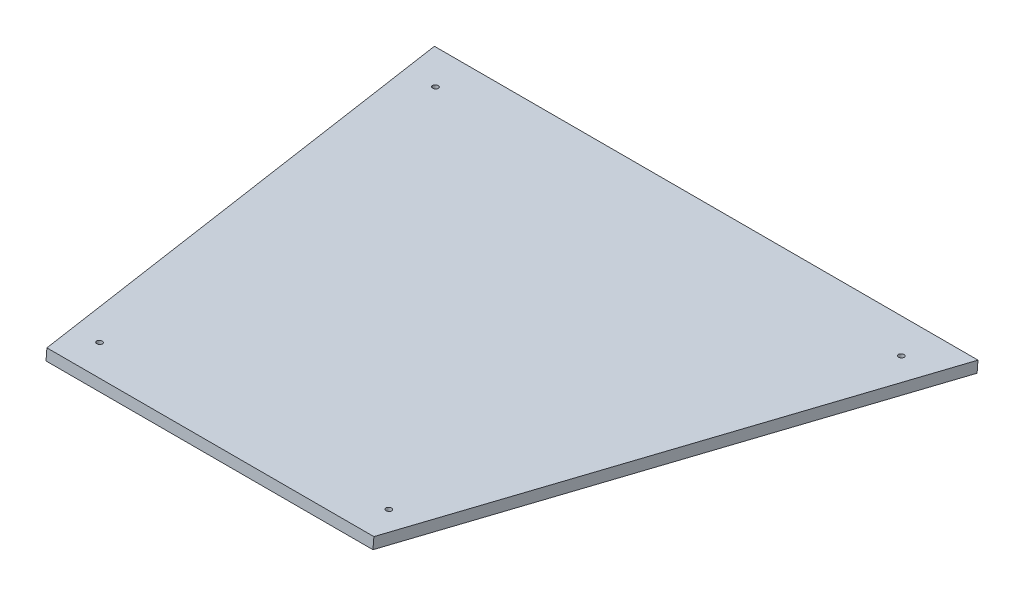
ISO-10303-21;
HEADER;
FILE_DESCRIPTION(('STEP AP214'),'2;1');
FILE_NAME('part.step','',(''),(''),'','','');
FILE_SCHEMA(('AUTOMOTIVE_DESIGN { 1 0 10303 214 1 1 1 1 }'));
ENDSEC;
DATA;
#1=APPLICATION_CONTEXT('core data for automotive mechanical design processes');
#2=APPLICATION_PROTOCOL_DEFINITION('international standard','automotive_design',2000,#1);
#3=PRODUCT_CONTEXT('',#1,'mechanical');
#4=PRODUCT('Part','Part','',(#3));
#5=PRODUCT_RELATED_PRODUCT_CATEGORY('part','',(#4));
#6=PRODUCT_DEFINITION_FORMATION('','',#4);
#7=PRODUCT_DEFINITION_CONTEXT('part definition',#1,'design');
#8=PRODUCT_DEFINITION('design','',#6,#7);
#9=PRODUCT_DEFINITION_SHAPE('','',#8);
#10=(LENGTH_UNIT() NAMED_UNIT(*) SI_UNIT(.MILLI.,.METRE.));
#11=(NAMED_UNIT(*) PLANE_ANGLE_UNIT() SI_UNIT($,.RADIAN.));
#12=(NAMED_UNIT(*) SI_UNIT($,.STERADIAN.) SOLID_ANGLE_UNIT());
#13=UNCERTAINTY_MEASURE_WITH_UNIT(LENGTH_MEASURE(1.E-05),#10,'distance_accuracy_value','');
#14=(GEOMETRIC_REPRESENTATION_CONTEXT(3) GLOBAL_UNCERTAINTY_ASSIGNED_CONTEXT((#13)) GLOBAL_UNIT_ASSIGNED_CONTEXT((#10,
#11,#12)) REPRESENTATION_CONTEXT('',''));
#15=CARTESIAN_POINT('',(0.,0.,0.));
#16=DIRECTION('',(0.,0.,1.));
#17=DIRECTION('',(1.,0.,0.));
#18=AXIS2_PLACEMENT_3D('',#15,#16,#17);
#19=CARTESIAN_POINT('',(-802.420278967548,-8159.73099657473,1994.33705132153));
#20=DIRECTION('',(-0.977114372171188,-0.017488083692269,-0.211994506120507));
#21=DIRECTION('',(-0.212026931023597,0.,0.977263823397098));
#22=AXIS2_PLACEMENT_3D('',#19,#20,#21);
#23=PLANE('',#22);
#24=DIRECTION('',(-0.212714606213347,0.0803326947584073,0.973806528246938));
#25=VECTOR('',#24,1.);
#26=CARTESIAN_POINT('',(-802.420277953014,-8147.07399010885,1993.29293096324));
#27=LINE('',#26,#25);
#28=CARTESIAN_POINT('',(-802.420277953014,-8147.07399010885,1993.29293096324));
#29=VERTEX_POINT('',#28);
#30=CARTESIAN_POINT('',(-927.933020681222,-8099.67349876805,2567.88971311519));
#31=VERTEX_POINT('',#30);
#32=EDGE_CURVE('E102',#29,#31,#27,.T.);
#33=ORIENTED_EDGE('',*,*,#32,.T.);
#34=DIRECTION('',(7.98845775629922E-08,0.996614682353027,-0.0822142014397074));
#35=VECTOR('',#34,1.);
#36=CARTESIAN_POINT('',(-927.933021695756,-8112.33050523394,2568.93383347347));
#37=LINE('',#36,#35);
#38=CARTESIAN_POINT('',(-927.933021695756,-8112.33050523394,2568.93383347347));
#39=VERTEX_POINT('',#38);
#40=EDGE_CURVE('E11',#39,#31,#37,.T.);
#41=ORIENTED_EDGE('',*,*,#40,.F.);
#42=DIRECTION('',(-0.212714606213347,0.0803326947584073,0.973806528246938));
#43=VECTOR('',#42,1.);
#44=CARTESIAN_POINT('',(-802.420278967548,-8159.73099657473,1994.33705132153));
#45=LINE('',#44,#43);
#46=CARTESIAN_POINT('',(-802.420278967548,-8159.73099657473,1994.33705132153));
#47=VERTEX_POINT('',#46);
#48=EDGE_CURVE('E90',#47,#39,#45,.T.);
#49=ORIENTED_EDGE('',*,*,#48,.F.);
#50=DIRECTION('',(7.98845775629922E-08,0.996614682353027,-0.0822142014397074));
#51=VECTOR('',#50,1.);
#52=CARTESIAN_POINT('',(-802.420278967548,-8159.73099657473,1994.33705132153));
#53=LINE('',#52,#51);
#54=EDGE_CURVE('E98',#47,#29,#53,.T.);
#55=ORIENTED_EDGE('',*,*,#54,.T.);
#56=EDGE_LOOP('',(#33,#41,#49,#55));
#57=FACE_BOUND('',#56,.T.);
#58=ADVANCED_FACE('F39',(#57),#23,.F.);
#59=CARTESIAN_POINT('',(-927.933021695756,-8112.33050523394,2568.93383347347));
#60=DIRECTION('',(0.,-0.0822142014397076,-0.99661468235303));
#61=DIRECTION('',(0.,0.99661468235303,-0.0822142014397076));
#62=AXIS2_PLACEMENT_3D('',#59,#60,#61);
#63=PLANE('',#62);
#64=DIRECTION('',(-0.999999999999997,7.96141429601646E-08,-6.56766222484603E-09));
#65=VECTOR('',#64,1.);
#66=CARTESIAN_POINT('',(-927.933020681222,-8099.67349876805,2567.88971311519));
#67=LINE('',#66,#65);
#68=CARTESIAN_POINT('',(-1306.83998180048,-8099.6734686017,2567.88971062666));
#69=VERTEX_POINT('',#68);
#70=EDGE_CURVE('E94',#31,#69,#67,.T.);
#71=ORIENTED_EDGE('',*,*,#70,.T.);
#72=DIRECTION('',(7.98845775629922E-08,0.996614682353027,-0.0822142014397074));
#73=VECTOR('',#72,1.);
#74=CARTESIAN_POINT('',(-1306.83998281502,-8112.33047506758,2568.93383098494));
#75=LINE('',#74,#73);
#76=CARTESIAN_POINT('',(-1306.83998281502,-8112.33047506758,2568.93383098494));
#77=VERTEX_POINT('',#76);
#78=EDGE_CURVE('E47',#77,#69,#75,.T.);
#79=ORIENTED_EDGE('',*,*,#78,.F.);
#80=DIRECTION('',(-0.999999999999997,7.96141429601646E-08,-6.56766222484603E-09));
#81=VECTOR('',#80,1.);
#82=CARTESIAN_POINT('',(-927.933021695756,-8112.33050523394,2568.93383347347));
#83=LINE('',#82,#81);
#84=EDGE_CURVE('E85',#39,#77,#83,.T.);
#85=ORIENTED_EDGE('',*,*,#84,.F.);
#86=ORIENTED_EDGE('',*,*,#40,.T.);
#87=EDGE_LOOP('',(#71,#79,#85,#86));
#88=FACE_BOUND('',#87,.T.);
#89=ADVANCED_FACE('F93',(#88),#63,.F.);
#90=CARTESIAN_POINT('',(-1306.83998281502,-8112.33047506758,2568.93383098494));
#91=DIRECTION('',(0.977114372171189,-0.0174882392765151,-0.211994493285818));
#92=DIRECTION('',(-0.212026918764023,0.,-0.977263826056932));
#93=AXIS2_PLACEMENT_3D('',#90,#91,#92);
#94=PLANE('',#93);
#95=DIRECTION('',(-0.212714606213342,-0.0803326608882263,-0.973806531041007));
#96=VECTOR('',#95,1.);
#97=CARTESIAN_POINT('',(-1306.83998180048,-8099.6734686017,2567.88971062666));
#98=LINE('',#97,#96);
#99=CARTESIAN_POINT('',(-1432.35272452869,-8147.07393995731,1993.29292682606));
#100=VERTEX_POINT('',#99);
#101=EDGE_CURVE('E72',#69,#100,#98,.T.);
#102=ORIENTED_EDGE('',*,*,#101,.T.);
#103=DIRECTION('',(7.98845775629922E-08,0.996614682353027,-0.0822142014397074));
#104=VECTOR('',#103,1.);
#105=CARTESIAN_POINT('',(-1432.35272554322,-8159.7309464232,1994.33704718434));
#106=LINE('',#105,#104);
#107=CARTESIAN_POINT('',(-1432.35272554322,-8159.7309464232,1994.33704718434));
#108=VERTEX_POINT('',#107);
#109=EDGE_CURVE('E95',#108,#100,#106,.T.);
#110=ORIENTED_EDGE('',*,*,#109,.F.);
#111=DIRECTION('',(-0.212714606213342,-0.0803326608882263,-0.973806531041007));
#112=VECTOR('',#111,1.);
#113=CARTESIAN_POINT('',(-1306.83998281502,-8112.33047506758,2568.93383098494));
#114=LINE('',#113,#112);
#115=EDGE_CURVE('E88',#77,#108,#114,.T.);
#116=ORIENTED_EDGE('',*,*,#115,.F.);
#117=ORIENTED_EDGE('',*,*,#78,.T.);
#118=EDGE_LOOP('',(#102,#110,#116,#117));
#119=FACE_BOUND('',#118,.T.);
#120=ADVANCED_FACE('F96',(#119),#94,.F.);
#121=CARTESIAN_POINT('',(-1432.35272554322,-8159.7309464232,1994.33704718434));
#122=DIRECTION('',(0.,0.0822142014397076,0.99661468235303));
#123=DIRECTION('',(0.,-0.99661468235303,0.0822142014397076));
#124=AXIS2_PLACEMENT_3D('',#121,#122,#123);
#125=PLANE('',#124);
#126=DIRECTION('',(0.999999999999997,-7.96141414857381E-08,6.56766108976135E-09));
#127=VECTOR('',#126,1.);
#128=CARTESIAN_POINT('',(-1432.35272452869,-8147.07393995731,1993.29292682606));
#129=LINE('',#128,#127);
#130=EDGE_CURVE('E78',#100,#29,#129,.T.);
#131=ORIENTED_EDGE('',*,*,#130,.T.);
#132=ORIENTED_EDGE('',*,*,#54,.F.);
#133=DIRECTION('',(0.999999999999997,-7.96141414857381E-08,6.56766108976135E-09));
#134=VECTOR('',#133,1.);
#135=CARTESIAN_POINT('',(-1432.35272554322,-8159.7309464232,1994.33704718434));
#136=LINE('',#135,#134);
#137=EDGE_CURVE('E55',#108,#47,#136,.T.);
#138=ORIENTED_EDGE('',*,*,#137,.F.);
#139=ORIENTED_EDGE('',*,*,#109,.T.);
#140=EDGE_LOOP('',(#131,#132,#138,#139));
#141=FACE_BOUND('',#140,.T.);
#142=ADVANCED_FACE('F110',(#141),#125,.F.);
#143=CARTESIAN_POINT('',(-0.000662728106999173,-8267.98577318668,682.054820076012));
#144=DIRECTION('',(-7.98845789021946E-08,-0.996614682353027,0.0822142014397076));
#145=DIRECTION('',(0.,-0.0822142014397078,-0.99661468235303));
#146=AXIS2_PLACEMENT_3D('',#143,#144,#145);
#147=PLANE('',#146);
#148=CARTESIAN_POINT('',(-847.471286967812,-8156.11674243441,2038.14961752106));
#149=DIRECTION('',(-7.98845789021946E-08,-0.996614682353027,0.0822142014397076));
#150=DIRECTION('',(0.,-0.0822142014397078,-0.99661468235303));
#151=AXIS2_PLACEMENT_3D('',#148,#149,#150);
#152=CIRCLE('',#151,3.17500000172961);
#153=CARTESIAN_POINT('',(-847.471286967812,-8156.37777252412,2034.98536590287));
#154=VERTEX_POINT('',#153);
#155=EDGE_CURVE('E105',#154,#154,#152,.T.);
#156=ORIENTED_EDGE('',*,*,#155,.F.);
#157=EDGE_LOOP('',(#156));
#158=FACE_BOUND('',#157,.T.);
#159=CARTESIAN_POINT('',(-1387.30171754303,-8156.11669945627,2038.14961397565));
#160=DIRECTION('',(-7.98845789021946E-08,-0.996614682353027,0.0822142014397076));
#161=DIRECTION('',(0.,-0.0822142014397078,-0.99661468235303));
#162=AXIS2_PLACEMENT_3D('',#159,#160,#161);
#163=CIRCLE('',#162,3.17500000173342);
#164=CARTESIAN_POINT('',(-1387.30171754303,-8156.37772954598,2034.98536235745));
#165=VERTEX_POINT('',#164);
#166=EDGE_CURVE('E118',#165,#165,#163,.T.);
#167=ORIENTED_EDGE('',*,*,#166,.F.);
#168=EDGE_LOOP('',(#167));
#169=FACE_BOUND('',#168,.T.);
#170=CARTESIAN_POINT('',(-949.798124309037,-8115.5656103709,2529.71731164787));
#171=DIRECTION('',(-7.98845789021946E-08,-0.996614682353027,0.0822142014397076));
#172=DIRECTION('',(0.,-0.0822142014397078,-0.99661468235303));
#173=AXIS2_PLACEMENT_3D('',#170,#171,#172);
#174=CIRCLE('',#173,3.17500000173217);
#175=CARTESIAN_POINT('',(-949.798124309037,-8115.82664046061,2526.55306002967));
#176=VERTEX_POINT('',#175);
#177=EDGE_CURVE('E121',#176,#176,#174,.T.);
#178=ORIENTED_EDGE('',*,*,#177,.F.);
#179=EDGE_LOOP('',(#178));
#180=FACE_BOUND('',#179,.T.);
#181=CARTESIAN_POINT('',(-1284.95725856523,-8115.55892879306,2529.79798122093));
#182=DIRECTION('',(-7.98845789021946E-08,-0.996614682353027,0.0822142014397076));
#183=DIRECTION('',(0.,-0.0822142014397078,-0.99661468235303));
#184=AXIS2_PLACEMENT_3D('',#181,#182,#183);
#185=CIRCLE('',#184,3.17500000173373);
#186=CARTESIAN_POINT('',(-1284.95725856523,-8115.81995888277,2526.63372960273));
#187=VERTEX_POINT('',#186);
#188=EDGE_CURVE('E124',#187,#187,#185,.T.);
#189=ORIENTED_EDGE('',*,*,#188,.F.);
#190=EDGE_LOOP('',(#189));
#191=FACE_BOUND('',#190,.T.);
#192=ORIENTED_EDGE('',*,*,#48,.T.);
#193=ORIENTED_EDGE('',*,*,#84,.T.);
#194=ORIENTED_EDGE('',*,*,#115,.T.);
#195=ORIENTED_EDGE('',*,*,#137,.T.);
#196=EDGE_LOOP('',(#192,#193,#194,#195));
#197=FACE_BOUND('',#196,.T.);
#198=ADVANCED_FACE('F86',(#158,#169,#180,#191,#197),#147,.T.);
#199=CARTESIAN_POINT('',(-0.000661713572864123,-8255.3287667208,681.010699717728));
#200=DIRECTION('',(-7.98845789021946E-08,-0.996614682353027,0.0822142014397076));
#201=DIRECTION('',(0.,-0.0822142014397078,-0.99661468235303));
#202=AXIS2_PLACEMENT_3D('',#199,#200,#201);
#203=PLANE('',#202);
#204=CARTESIAN_POINT('',(-847.471285953278,-8143.45973596853,2037.10549716278));
#205=DIRECTION('',(7.98845789021947E-08,0.996614682353027,-0.0822142014397045));
#206=DIRECTION('',(0.,0.0822142014397048,0.996614682353031));
#207=AXIS2_PLACEMENT_3D('',#204,#205,#206);
#208=CIRCLE('',#207,3.17500000172961);
#209=CARTESIAN_POINT('',(-847.471285953278,-8143.19870587882,2040.26974878097));
#210=VERTEX_POINT('',#209);
#211=EDGE_CURVE('E131',#210,#210,#208,.T.);
#212=ORIENTED_EDGE('',*,*,#211,.F.);
#213=EDGE_LOOP('',(#212));
#214=FACE_BOUND('',#213,.T.);
#215=CARTESIAN_POINT('',(-1387.3017165285,-8143.45969299039,2037.10549361736));
#216=DIRECTION('',(7.98845789021947E-08,0.996614682353027,-0.0822142014397045));
#217=DIRECTION('',(0.,0.0822142014397048,0.996614682353031));
#218=AXIS2_PLACEMENT_3D('',#215,#216,#217);
#219=CIRCLE('',#218,3.17500000173342);
#220=CARTESIAN_POINT('',(-1387.3017165285,-8143.19866290068,2040.26974523556));
#221=VERTEX_POINT('',#220);
#222=EDGE_CURVE('E134',#221,#221,#219,.T.);
#223=ORIENTED_EDGE('',*,*,#222,.F.);
#224=EDGE_LOOP('',(#223));
#225=FACE_BOUND('',#224,.T.);
#226=CARTESIAN_POINT('',(-949.798123294502,-8102.90860390502,2528.67319128958));
#227=DIRECTION('',(7.98845789021947E-08,0.996614682353027,-0.0822142014397045));
#228=DIRECTION('',(0.,0.0822142014397048,0.996614682353031));
#229=AXIS2_PLACEMENT_3D('',#226,#227,#228);
#230=CIRCLE('',#229,3.17500000173217);
#231=CARTESIAN_POINT('',(-949.798123294502,-8102.64757381531,2531.83744290778));
#232=VERTEX_POINT('',#231);
#233=EDGE_CURVE('E130',#232,#232,#230,.T.);
#234=ORIENTED_EDGE('',*,*,#233,.F.);
#235=EDGE_LOOP('',(#234));
#236=FACE_BOUND('',#235,.T.);
#237=CARTESIAN_POINT('',(-1284.9572575507,-8102.90192232718,2528.75386086265));
#238=DIRECTION('',(7.98845789021947E-08,0.996614682353027,-0.0822142014397045));
#239=DIRECTION('',(0.,0.0822142014397048,0.996614682353031));
#240=AXIS2_PLACEMENT_3D('',#237,#238,#239);
#241=CIRCLE('',#240,3.17500000173373);
#242=CARTESIAN_POINT('',(-1284.9572575507,-8102.64089223747,2531.91811248085));
#243=VERTEX_POINT('',#242);
#244=EDGE_CURVE('E127',#243,#243,#241,.T.);
#245=ORIENTED_EDGE('',*,*,#244,.F.);
#246=EDGE_LOOP('',(#245));
#247=FACE_BOUND('',#246,.T.);
#248=ORIENTED_EDGE('',*,*,#32,.F.);
#249=ORIENTED_EDGE('',*,*,#130,.F.);
#250=ORIENTED_EDGE('',*,*,#101,.F.);
#251=ORIENTED_EDGE('',*,*,#70,.F.);
#252=EDGE_LOOP('',(#248,#249,#250,#251));
#253=FACE_BOUND('',#252,.T.);
#254=ADVANCED_FACE('F113',(#214,#225,#236,#247,#253),#203,.F.);
#255=CARTESIAN_POINT('',(-1284.95726233898,-8162.6390720806,2533.6817855162));
#256=DIRECTION('',(7.98845789021947E-08,0.996614682353027,-0.0822142014397045));
#257=DIRECTION('',(0.,0.0822142014397048,0.996614682353031));
#258=AXIS2_PLACEMENT_3D('',#255,#256,#257);
#259=CYLINDRICAL_SURFACE('',#258,3.17500000173373);
#260=ORIENTED_EDGE('',*,*,#188,.T.);
#261=EDGE_LOOP('',(#260));
#262=FACE_BOUND('',#261,.T.);
#263=ORIENTED_EDGE('',*,*,#244,.T.);
#264=EDGE_LOOP('',(#263));
#265=FACE_BOUND('',#264,.T.);
#266=ADVANCED_FACE('F144',(#262,#265),#259,.F.);
#267=CARTESIAN_POINT('',(-949.798128082789,-8162.64575365844,2533.60111594314));
#268=DIRECTION('',(7.98845789021947E-08,0.996614682353027,-0.0822142014397045));
#269=DIRECTION('',(0.,0.0822142014397048,0.996614682353031));
#270=AXIS2_PLACEMENT_3D('',#267,#268,#269);
#271=CYLINDRICAL_SURFACE('',#270,3.17500000173217);
#272=ORIENTED_EDGE('',*,*,#177,.T.);
#273=EDGE_LOOP('',(#272));
#274=FACE_BOUND('',#273,.T.);
#275=ORIENTED_EDGE('',*,*,#233,.T.);
#276=EDGE_LOOP('',(#275));
#277=FACE_BOUND('',#276,.T.);
#278=ADVANCED_FACE('F140',(#274,#277),#271,.F.);
#279=CARTESIAN_POINT('',(-1387.30172131679,-8203.19684274382,2042.03341827092));
#280=DIRECTION('',(7.98845789021947E-08,0.996614682353027,-0.0822142014397045));
#281=DIRECTION('',(0.,0.0822142014397048,0.996614682353031));
#282=AXIS2_PLACEMENT_3D('',#279,#280,#281);
#283=CYLINDRICAL_SURFACE('',#282,3.17500000173342);
#284=ORIENTED_EDGE('',*,*,#166,.T.);
#285=EDGE_LOOP('',(#284));
#286=FACE_BOUND('',#285,.T.);
#287=ORIENTED_EDGE('',*,*,#222,.T.);
#288=EDGE_LOOP('',(#287));
#289=FACE_BOUND('',#288,.T.);
#290=ADVANCED_FACE('F155',(#286,#289),#283,.F.);
#291=CARTESIAN_POINT('',(-847.471290741565,-8203.19688572195,2042.03342181633));
#292=DIRECTION('',(7.98845789021947E-08,0.996614682353027,-0.0822142014397045));
#293=DIRECTION('',(0.,0.0822142014397048,0.996614682353031));
#294=AXIS2_PLACEMENT_3D('',#291,#292,#293);
#295=CYLINDRICAL_SURFACE('',#294,3.17500000172961);
#296=ORIENTED_EDGE('',*,*,#155,.T.);
#297=EDGE_LOOP('',(#296));
#298=FACE_BOUND('',#297,.T.);
#299=ORIENTED_EDGE('',*,*,#211,.T.);
#300=EDGE_LOOP('',(#299));
#301=FACE_BOUND('',#300,.T.);
#302=ADVANCED_FACE('F184',(#298,#301),#295,.F.);
#303=CLOSED_SHELL('',(#58,#89,#120,#142,#198,#254,#266,#278,#290,#302));
#304=MANIFOLD_SOLID_BREP('B2',#303);
#305=ADVANCED_BREP_SHAPE_REPRESENTATION('',(#18,#304),#14);
#306=SHAPE_DEFINITION_REPRESENTATION(#9,#305);
ENDSEC;
END-ISO-10303-21;
